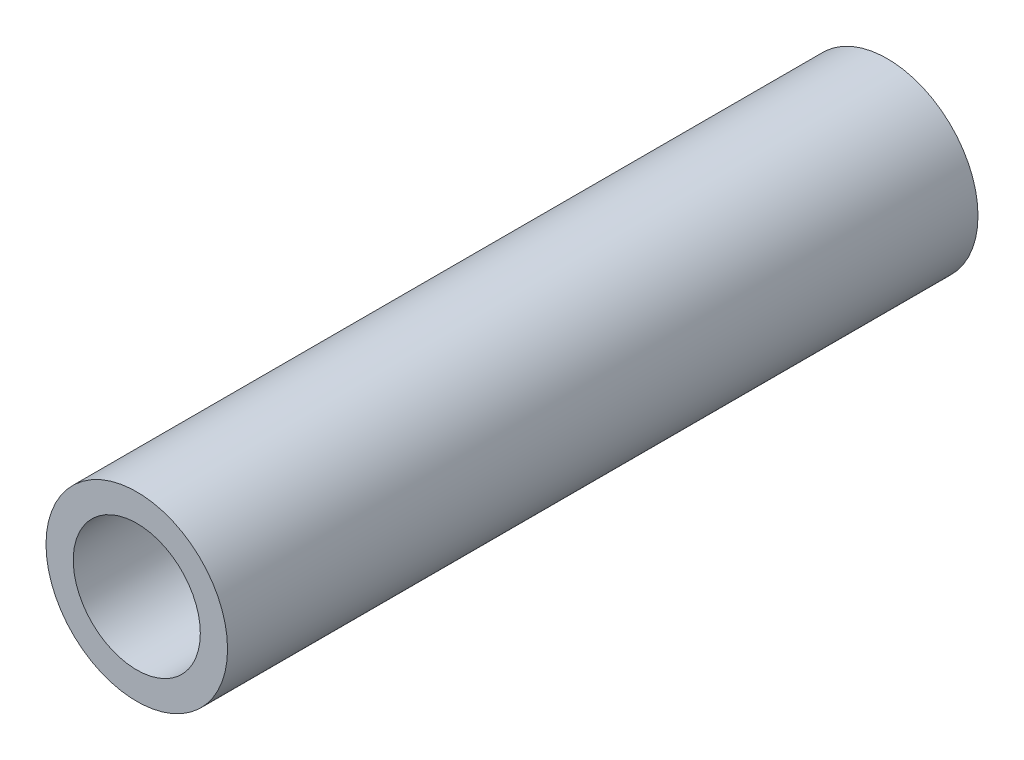
ISO-10303-21;
HEADER;
FILE_DESCRIPTION(('STEP AP214'),'2;1');
FILE_NAME('part.step','',(''),(''),'','','');
FILE_SCHEMA(('AUTOMOTIVE_DESIGN { 1 0 10303 214 1 1 1 1 }'));
ENDSEC;
DATA;
#1=APPLICATION_CONTEXT('core data for automotive mechanical design processes');
#2=APPLICATION_PROTOCOL_DEFINITION('international standard','automotive_design',2000,#1);
#3=PRODUCT_CONTEXT('',#1,'mechanical');
#4=PRODUCT('Part','Part','',(#3));
#5=PRODUCT_RELATED_PRODUCT_CATEGORY('part','',(#4));
#6=PRODUCT_DEFINITION_FORMATION('','',#4);
#7=PRODUCT_DEFINITION_CONTEXT('part definition',#1,'design');
#8=PRODUCT_DEFINITION('design','',#6,#7);
#9=PRODUCT_DEFINITION_SHAPE('','',#8);
#10=(LENGTH_UNIT() NAMED_UNIT(*) SI_UNIT(.MILLI.,.METRE.));
#11=(NAMED_UNIT(*) PLANE_ANGLE_UNIT() SI_UNIT($,.RADIAN.));
#12=(NAMED_UNIT(*) SI_UNIT($,.STERADIAN.) SOLID_ANGLE_UNIT());
#13=UNCERTAINTY_MEASURE_WITH_UNIT(LENGTH_MEASURE(1.E-05),#10,'distance_accuracy_value','');
#14=(GEOMETRIC_REPRESENTATION_CONTEXT(3) GLOBAL_UNCERTAINTY_ASSIGNED_CONTEXT((#13)) GLOBAL_UNIT_ASSIGNED_CONTEXT((#10,
#11,#12)) REPRESENTATION_CONTEXT('',''));
#15=CARTESIAN_POINT('',(0.,0.,0.));
#16=DIRECTION('',(0.,0.,1.));
#17=DIRECTION('',(1.,0.,0.));
#18=AXIS2_PLACEMENT_3D('',#15,#16,#17);
#19=CARTESIAN_POINT('',(0.,0.,-31.));
#20=DIRECTION('',(0.,0.,1.));
#21=DIRECTION('',(1.,0.,0.));
#22=AXIS2_PLACEMENT_3D('',#19,#20,#21);
#23=CYLINDRICAL_SURFACE('',#22,3.75);
#24=CARTESIAN_POINT('',(0.,0.,-31.));
#25=DIRECTION('',(0.,0.,1.));
#26=DIRECTION('',(1.,0.,0.));
#27=AXIS2_PLACEMENT_3D('',#24,#25,#26);
#28=CIRCLE('',#27,3.75);
#29=CARTESIAN_POINT('',(3.75,0.,-31.));
#30=VERTEX_POINT('',#29);
#31=EDGE_CURVE('E10',#30,#30,#28,.T.);
#32=ORIENTED_EDGE('',*,*,#31,.T.);
#33=EDGE_LOOP('',(#32));
#34=FACE_BOUND('',#33,.T.);
#35=CARTESIAN_POINT('',(0.,0.,0.));
#36=DIRECTION('',(0.,0.,1.));
#37=DIRECTION('',(1.,0.,0.));
#38=AXIS2_PLACEMENT_3D('',#35,#36,#37);
#39=CIRCLE('',#38,3.75);
#40=CARTESIAN_POINT('',(3.75,0.,0.));
#41=VERTEX_POINT('',#40);
#42=EDGE_CURVE('E33',#41,#41,#39,.T.);
#43=ORIENTED_EDGE('',*,*,#42,.F.);
#44=EDGE_LOOP('',(#43));
#45=FACE_BOUND('',#44,.T.);
#46=ADVANCED_FACE('F30',(#34,#45),#23,.T.);
#47=CARTESIAN_POINT('',(0.,0.,-31.));
#48=DIRECTION('',(0.,0.,1.));
#49=DIRECTION('',(1.,0.,0.));
#50=AXIS2_PLACEMENT_3D('',#47,#48,#49);
#51=PLANE('',#50);
#52=CARTESIAN_POINT('',(0.,0.,-31.));
#53=DIRECTION('',(0.,0.,1.));
#54=DIRECTION('',(1.,0.,0.));
#55=AXIS2_PLACEMENT_3D('',#52,#53,#54);
#56=CIRCLE('',#55,2.625);
#57=CARTESIAN_POINT('',(2.625,0.,-31.));
#58=VERTEX_POINT('',#57);
#59=EDGE_CURVE('E40',#58,#58,#56,.T.);
#60=ORIENTED_EDGE('',*,*,#59,.T.);
#61=EDGE_LOOP('',(#60));
#62=FACE_BOUND('',#61,.T.);
#63=ORIENTED_EDGE('',*,*,#31,.F.);
#64=EDGE_LOOP('',(#63));
#65=FACE_BOUND('',#64,.T.);
#66=ADVANCED_FACE('F48',(#62,#65),#51,.F.);
#67=CARTESIAN_POINT('',(0.,0.,0.));
#68=DIRECTION('',(0.,0.,1.));
#69=DIRECTION('',(1.,0.,0.));
#70=AXIS2_PLACEMENT_3D('',#67,#68,#69);
#71=PLANE('',#70);
#72=CARTESIAN_POINT('',(0.,0.,0.));
#73=DIRECTION('',(0.,0.,1.));
#74=DIRECTION('',(1.,0.,0.));
#75=AXIS2_PLACEMENT_3D('',#72,#73,#74);
#76=CIRCLE('',#75,2.625);
#77=CARTESIAN_POINT('',(2.625,0.,0.));
#78=VERTEX_POINT('',#77);
#79=EDGE_CURVE('E42',#78,#78,#76,.T.);
#80=ORIENTED_EDGE('',*,*,#79,.F.);
#81=EDGE_LOOP('',(#80));
#82=FACE_BOUND('',#81,.T.);
#83=ORIENTED_EDGE('',*,*,#42,.T.);
#84=EDGE_LOOP('',(#83));
#85=FACE_BOUND('',#84,.T.);
#86=ADVANCED_FACE('F54',(#82,#85),#71,.T.);
#87=CARTESIAN_POINT('',(0.,0.,-31.));
#88=DIRECTION('',(0.,0.,1.));
#89=DIRECTION('',(1.,0.,0.));
#90=AXIS2_PLACEMENT_3D('',#87,#88,#89);
#91=CYLINDRICAL_SURFACE('',#90,2.625);
#92=ORIENTED_EDGE('',*,*,#59,.F.);
#93=EDGE_LOOP('',(#92));
#94=FACE_BOUND('',#93,.T.);
#95=ORIENTED_EDGE('',*,*,#79,.T.);
#96=EDGE_LOOP('',(#95));
#97=FACE_BOUND('',#96,.T.);
#98=ADVANCED_FACE('F51',(#94,#97),#91,.F.);
#99=CLOSED_SHELL('',(#46,#66,#86,#98));
#100=MANIFOLD_SOLID_BREP('B2',#99);
#101=ADVANCED_BREP_SHAPE_REPRESENTATION('',(#18,#100),#14);
#102=SHAPE_DEFINITION_REPRESENTATION(#9,#101);
ENDSEC;
END-ISO-10303-21;
